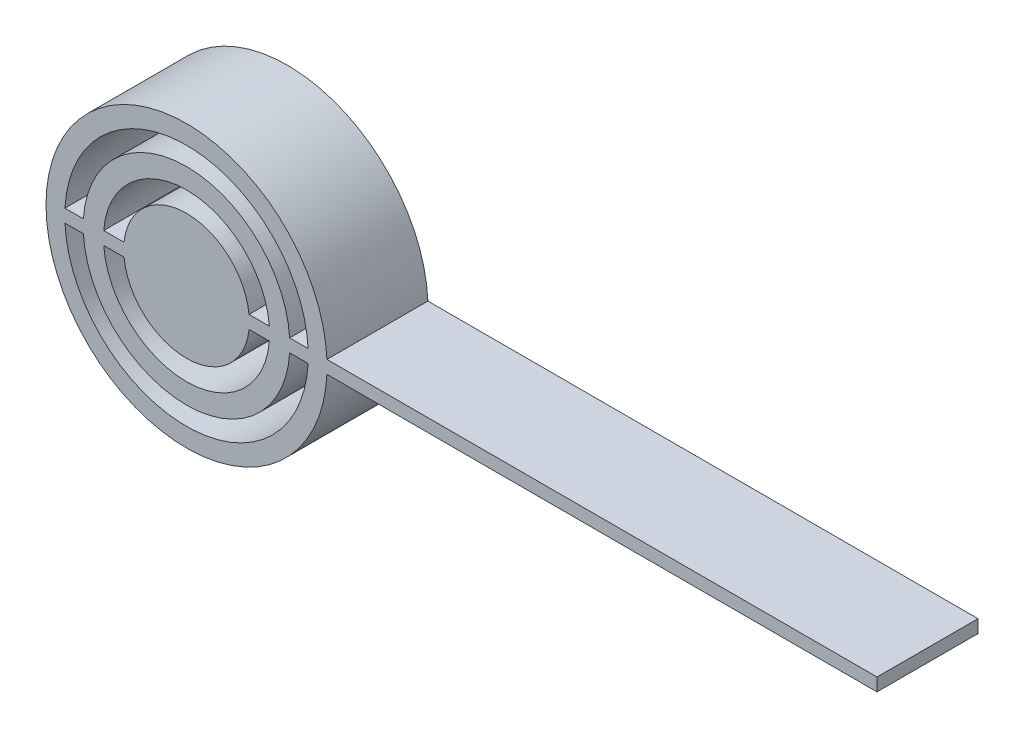
ISO-10303-21;
HEADER;
FILE_DESCRIPTION(('STEP AP214'),'2;1');
FILE_NAME('part.step','',(''),(''),'','','');
FILE_SCHEMA(('AUTOMOTIVE_DESIGN { 1 0 10303 214 1 1 1 1 }'));
ENDSEC;
DATA;
#1=APPLICATION_CONTEXT('core data for automotive mechanical design processes');
#2=APPLICATION_PROTOCOL_DEFINITION('international standard','automotive_design',2000,#1);
#3=PRODUCT_CONTEXT('',#1,'mechanical');
#4=PRODUCT('Part','Part','',(#3));
#5=PRODUCT_RELATED_PRODUCT_CATEGORY('part','',(#4));
#6=PRODUCT_DEFINITION_FORMATION('','',#4);
#7=PRODUCT_DEFINITION_CONTEXT('part definition',#1,'design');
#8=PRODUCT_DEFINITION('design','',#6,#7);
#9=PRODUCT_DEFINITION_SHAPE('','',#8);
#10=(LENGTH_UNIT() NAMED_UNIT(*) SI_UNIT(.MILLI.,.METRE.));
#11=(NAMED_UNIT(*) PLANE_ANGLE_UNIT() SI_UNIT($,.RADIAN.));
#12=(NAMED_UNIT(*) SI_UNIT($,.STERADIAN.) SOLID_ANGLE_UNIT());
#13=UNCERTAINTY_MEASURE_WITH_UNIT(LENGTH_MEASURE(1.E-05),#10,'distance_accuracy_value','');
#14=(GEOMETRIC_REPRESENTATION_CONTEXT(3) GLOBAL_UNCERTAINTY_ASSIGNED_CONTEXT((#13)) GLOBAL_UNIT_ASSIGNED_CONTEXT((#10,
#11,#12)) REPRESENTATION_CONTEXT('',''));
#15=CARTESIAN_POINT('',(0.,0.,0.));
#16=DIRECTION('',(0.,0.,1.));
#17=DIRECTION('',(1.,0.,0.));
#18=AXIS2_PLACEMENT_3D('',#15,#16,#17);
#19=CARTESIAN_POINT('',(0.,-2.55990989081378,40.));
#20=DIRECTION('',(0.,1.,0.));
#21=DIRECTION('',(0.,0.,1.));
#22=AXIS2_PLACEMENT_3D('',#19,#20,#21);
#23=PLANE('',#22);
#24=DIRECTION('',(1.,0.,0.));
#25=VECTOR('',#24,1.);
#26=CARTESIAN_POINT('',(0.,-2.55990989081378,0.));
#27=LINE('',#26,#25);
#28=CARTESIAN_POINT('',(-32.7995918708949,-2.55990989081378,0.));
#29=VERTEX_POINT('',#28);
#30=CARTESIAN_POINT('',(-24.7589770160316,-2.55990989081378,0.));
#31=VERTEX_POINT('',#30);
#32=EDGE_CURVE('E283',#29,#31,#27,.T.);
#33=ORIENTED_EDGE('',*,*,#32,.T.);
#34=DIRECTION('',(0.,0.,-1.));
#35=VECTOR('',#34,1.);
#36=CARTESIAN_POINT('',(-24.7589770160316,-2.55990989081378,40.));
#37=LINE('',#36,#35);
#38=CARTESIAN_POINT('',(-24.7589770160316,-2.55990989081378,40.));
#39=VERTEX_POINT('',#38);
#40=EDGE_CURVE('E11',#39,#31,#37,.T.);
#41=ORIENTED_EDGE('',*,*,#40,.F.);
#42=DIRECTION('',(1.,0.,0.));
#43=VECTOR('',#42,1.);
#44=CARTESIAN_POINT('',(0.,-2.55990989081378,40.));
#45=LINE('',#44,#43);
#46=CARTESIAN_POINT('',(-32.7995918708949,-2.55990989081378,40.));
#47=VERTEX_POINT('',#46);
#48=EDGE_CURVE('E199',#47,#39,#45,.T.);
#49=ORIENTED_EDGE('',*,*,#48,.F.);
#50=DIRECTION('',(0.,0.,-1.));
#51=VECTOR('',#50,1.);
#52=CARTESIAN_POINT('',(-32.7995918708949,-2.55990989081378,40.));
#53=LINE('',#52,#51);
#54=EDGE_CURVE('E67',#47,#29,#53,.T.);
#55=ORIENTED_EDGE('',*,*,#54,.T.);
#56=EDGE_LOOP('',(#33,#41,#49,#55));
#57=FACE_BOUND('',#56,.T.);
#58=ADVANCED_FACE('F47',(#57),#23,.F.);
#59=CARTESIAN_POINT('',(0.,0.,40.));
#60=DIRECTION('',(0.,0.,-1.));
#61=DIRECTION('',(-1.,0.,0.));
#62=AXIS2_PLACEMENT_3D('',#59,#60,#61);
#63=CYLINDRICAL_SURFACE('',#62,24.8909638529621);
#64=CARTESIAN_POINT('',(0.,0.,0.));
#65=DIRECTION('',(0.,0.,1.));
#66=DIRECTION('',(1.,0.,0.));
#67=AXIS2_PLACEMENT_3D('',#64,#65,#66);
#68=CIRCLE('',#67,24.8909638529621);
#69=CARTESIAN_POINT('',(24.7589770160316,-2.55990989081378,0.));
#70=VERTEX_POINT('',#69);
#71=EDGE_CURVE('E206',#31,#70,#68,.T.);
#72=ORIENTED_EDGE('',*,*,#71,.T.);
#73=DIRECTION('',(0.,0.,-1.));
#74=VECTOR('',#73,1.);
#75=CARTESIAN_POINT('',(24.7589770160316,-2.55990989081378,40.));
#76=LINE('',#75,#74);
#77=CARTESIAN_POINT('',(24.7589770160316,-2.55990989081378,40.));
#78=VERTEX_POINT('',#77);
#79=EDGE_CURVE('E58',#78,#70,#76,.T.);
#80=ORIENTED_EDGE('',*,*,#79,.F.);
#81=CARTESIAN_POINT('',(0.,0.,40.));
#82=DIRECTION('',(0.,0.,1.));
#83=DIRECTION('',(1.,0.,0.));
#84=AXIS2_PLACEMENT_3D('',#81,#82,#83);
#85=CIRCLE('',#84,24.8909638529621);
#86=EDGE_CURVE('E193',#39,#78,#85,.T.);
#87=ORIENTED_EDGE('',*,*,#86,.F.);
#88=ORIENTED_EDGE('',*,*,#40,.T.);
#89=EDGE_LOOP('',(#72,#80,#87,#88));
#90=FACE_BOUND('',#89,.T.);
#91=ADVANCED_FACE('F205',(#90),#63,.T.);
#92=CARTESIAN_POINT('',(0.,-2.55990989081378,40.));
#93=DIRECTION('',(0.,1.,0.));
#94=DIRECTION('',(0.,0.,1.));
#95=AXIS2_PLACEMENT_3D('',#92,#93,#94);
#96=PLANE('',#95);
#97=DIRECTION('',(1.,0.,0.));
#98=VECTOR('',#97,1.);
#99=CARTESIAN_POINT('',(0.,-2.55990989081378,0.));
#100=LINE('',#99,#98);
#101=CARTESIAN_POINT('',(32.7995918708949,-2.55990989081378,0.));
#102=VERTEX_POINT('',#101);
#103=EDGE_CURVE('E288',#70,#102,#100,.T.);
#104=ORIENTED_EDGE('',*,*,#103,.T.);
#105=DIRECTION('',(0.,0.,-1.));
#106=VECTOR('',#105,1.);
#107=CARTESIAN_POINT('',(32.7995918708949,-2.55990989081378,40.));
#108=LINE('',#107,#106);
#109=CARTESIAN_POINT('',(32.7995918708949,-2.55990989081378,40.));
#110=VERTEX_POINT('',#109);
#111=EDGE_CURVE('E130',#110,#102,#108,.T.);
#112=ORIENTED_EDGE('',*,*,#111,.F.);
#113=DIRECTION('',(1.,0.,0.));
#114=VECTOR('',#113,1.);
#115=CARTESIAN_POINT('',(0.,-2.55990989081378,40.));
#116=LINE('',#115,#114);
#117=EDGE_CURVE('E198',#78,#110,#116,.T.);
#118=ORIENTED_EDGE('',*,*,#117,.F.);
#119=ORIENTED_EDGE('',*,*,#79,.T.);
#120=EDGE_LOOP('',(#104,#112,#118,#119));
#121=FACE_BOUND('',#120,.T.);
#122=ADVANCED_FACE('F211',(#121),#96,.F.);
#123=CARTESIAN_POINT('',(0.,2.55990989081378,40.));
#124=DIRECTION('',(0.,1.,0.));
#125=DIRECTION('',(0.,0.,1.));
#126=AXIS2_PLACEMENT_3D('',#123,#124,#125);
#127=PLANE('',#126);
#128=DIRECTION('',(1.,0.,0.));
#129=VECTOR('',#128,1.);
#130=CARTESIAN_POINT('',(0.,2.55990989081378,0.));
#131=LINE('',#130,#129);
#132=CARTESIAN_POINT('',(40.8455882829981,2.55990989081378,0.));
#133=VERTEX_POINT('',#132);
#134=CARTESIAN_POINT('',(48.1587150737325,2.55990989081378,0.));
#135=VERTEX_POINT('',#134);
#136=EDGE_CURVE('E267',#133,#135,#131,.T.);
#137=ORIENTED_EDGE('',*,*,#136,.F.);
#138=DIRECTION('',(0.,0.,-1.));
#139=VECTOR('',#138,1.);
#140=CARTESIAN_POINT('',(40.8455882829981,2.55990989081378,40.));
#141=LINE('',#140,#139);
#142=CARTESIAN_POINT('',(40.8455882829981,2.55990989081378,40.));
#143=VERTEX_POINT('',#142);
#144=EDGE_CURVE('E298',#143,#133,#141,.T.);
#145=ORIENTED_EDGE('',*,*,#144,.F.);
#146=DIRECTION('',(1.,0.,0.));
#147=VECTOR('',#146,1.);
#148=CARTESIAN_POINT('',(0.,2.55990989081378,40.));
#149=LINE('',#148,#147);
#150=CARTESIAN_POINT('',(48.1587150737325,2.55990989081378,40.));
#151=VERTEX_POINT('',#150);
#152=EDGE_CURVE('E404',#143,#151,#149,.T.);
#153=ORIENTED_EDGE('',*,*,#152,.T.);
#154=DIRECTION('',(0.,0.,-1.));
#155=VECTOR('',#154,1.);
#156=CARTESIAN_POINT('',(48.1587150737325,2.55990989081378,40.));
#157=LINE('',#156,#155);
#158=EDGE_CURVE('E301',#151,#135,#157,.T.);
#159=ORIENTED_EDGE('',*,*,#158,.T.);
#160=EDGE_LOOP('',(#137,#145,#153,#159));
#161=FACE_BOUND('',#160,.T.);
#162=ADVANCED_FACE('F436',(#161),#127,.T.);
#163=CARTESIAN_POINT('',(0.,0.,40.));
#164=DIRECTION('',(0.,0.,-1.));
#165=DIRECTION('',(-1.,0.,0.));
#166=AXIS2_PLACEMENT_3D('',#163,#164,#165);
#167=CYLINDRICAL_SURFACE('',#166,40.9257281038869);
#168=CARTESIAN_POINT('',(0.,0.,0.));
#169=DIRECTION('',(0.,0.,1.));
#170=DIRECTION('',(1.,0.,0.));
#171=AXIS2_PLACEMENT_3D('',#168,#169,#170);
#172=CIRCLE('',#171,40.9257281038869);
#173=CARTESIAN_POINT('',(-40.8455882829981,2.55990989081378,0.));
#174=VERTEX_POINT('',#173);
#175=EDGE_CURVE('E271',#133,#174,#172,.T.);
#176=ORIENTED_EDGE('',*,*,#175,.T.);
#177=DIRECTION('',(0.,0.,-1.));
#178=VECTOR('',#177,1.);
#179=CARTESIAN_POINT('',(-40.8455882829981,2.55990989081378,40.));
#180=LINE('',#179,#178);
#181=CARTESIAN_POINT('',(-40.8455882829981,2.55990989081378,40.));
#182=VERTEX_POINT('',#181);
#183=EDGE_CURVE('E308',#182,#174,#180,.T.);
#184=ORIENTED_EDGE('',*,*,#183,.F.);
#185=CARTESIAN_POINT('',(0.,0.,40.));
#186=DIRECTION('',(0.,0.,1.));
#187=DIRECTION('',(1.,0.,0.));
#188=AXIS2_PLACEMENT_3D('',#185,#186,#187);
#189=CIRCLE('',#188,40.9257281038869);
#190=EDGE_CURVE('E408',#143,#182,#189,.T.);
#191=ORIENTED_EDGE('',*,*,#190,.F.);
#192=ORIENTED_EDGE('',*,*,#144,.T.);
#193=EDGE_LOOP('',(#176,#184,#191,#192));
#194=FACE_BOUND('',#193,.T.);
#195=ADVANCED_FACE('F438',(#194),#167,.T.);
#196=CARTESIAN_POINT('',(0.,2.55990989081378,40.));
#197=DIRECTION('',(0.,1.,0.));
#198=DIRECTION('',(0.,0.,1.));
#199=AXIS2_PLACEMENT_3D('',#196,#197,#198);
#200=PLANE('',#199);
#201=DIRECTION('',(1.,0.,0.));
#202=VECTOR('',#201,1.);
#203=CARTESIAN_POINT('',(0.,2.55990989081378,0.));
#204=LINE('',#203,#202);
#205=CARTESIAN_POINT('',(-48.1587150737325,2.55990989081378,0.));
#206=VERTEX_POINT('',#205);
#207=EDGE_CURVE('E275',#206,#174,#204,.T.);
#208=ORIENTED_EDGE('',*,*,#207,.F.);
#209=DIRECTION('',(0.,0.,-1.));
#210=VECTOR('',#209,1.);
#211=CARTESIAN_POINT('',(-48.1587150737325,2.55990989081378,40.));
#212=LINE('',#211,#210);
#213=CARTESIAN_POINT('',(-48.1587150737325,2.55990989081378,40.));
#214=VERTEX_POINT('',#213);
#215=EDGE_CURVE('E304',#214,#206,#212,.T.);
#216=ORIENTED_EDGE('',*,*,#215,.F.);
#217=DIRECTION('',(1.,0.,0.));
#218=VECTOR('',#217,1.);
#219=CARTESIAN_POINT('',(0.,2.55990989081378,40.));
#220=LINE('',#219,#218);
#221=EDGE_CURVE('E411',#214,#182,#220,.T.);
#222=ORIENTED_EDGE('',*,*,#221,.T.);
#223=ORIENTED_EDGE('',*,*,#183,.T.);
#224=EDGE_LOOP('',(#208,#216,#222,#223));
#225=FACE_BOUND('',#224,.T.);
#226=ADVANCED_FACE('F430',(#225),#200,.T.);
#227=CARTESIAN_POINT('',(0.,-2.55990989081378,40.));
#228=DIRECTION('',(0.,1.,0.));
#229=DIRECTION('',(0.,0.,1.));
#230=AXIS2_PLACEMENT_3D('',#227,#228,#229);
#231=PLANE('',#230);
#232=DIRECTION('',(1.,0.,0.));
#233=VECTOR('',#232,1.);
#234=CARTESIAN_POINT('',(0.,-2.55990989081378,0.));
#235=LINE('',#234,#233);
#236=CARTESIAN_POINT('',(-48.1587150737325,-2.55990989081378,0.));
#237=VERTEX_POINT('',#236);
#238=CARTESIAN_POINT('',(-40.8455882829981,-2.55990989081378,0.));
#239=VERTEX_POINT('',#238);
#240=EDGE_CURVE('E252',#237,#239,#235,.T.);
#241=ORIENTED_EDGE('',*,*,#240,.T.);
#242=DIRECTION('',(0.,0.,-1.));
#243=VECTOR('',#242,1.);
#244=CARTESIAN_POINT('',(-40.8455882829981,-2.55990989081378,40.));
#245=LINE('',#244,#243);
#246=CARTESIAN_POINT('',(-40.8455882829981,-2.55990989081378,40.));
#247=VERTEX_POINT('',#246);
#248=EDGE_CURVE('E305',#247,#239,#245,.T.);
#249=ORIENTED_EDGE('',*,*,#248,.F.);
#250=DIRECTION('',(1.,0.,0.));
#251=VECTOR('',#250,1.);
#252=CARTESIAN_POINT('',(0.,-2.55990989081378,40.));
#253=LINE('',#252,#251);
#254=CARTESIAN_POINT('',(-48.1587150737325,-2.55990989081378,40.));
#255=VERTEX_POINT('',#254);
#256=EDGE_CURVE('E390',#255,#247,#253,.T.);
#257=ORIENTED_EDGE('',*,*,#256,.F.);
#258=DIRECTION('',(0.,0.,-1.));
#259=VECTOR('',#258,1.);
#260=CARTESIAN_POINT('',(-48.1587150737325,-2.55990989081378,40.));
#261=LINE('',#260,#259);
#262=EDGE_CURVE('E313',#255,#237,#261,.T.);
#263=ORIENTED_EDGE('',*,*,#262,.T.);
#264=EDGE_LOOP('',(#241,#249,#257,#263));
#265=FACE_BOUND('',#264,.T.);
#266=ADVANCED_FACE('F445',(#265),#231,.F.);
#267=CARTESIAN_POINT('',(0.,0.,40.));
#268=DIRECTION('',(0.,0.,-1.));
#269=DIRECTION('',(-1.,0.,0.));
#270=AXIS2_PLACEMENT_3D('',#267,#268,#269);
#271=CYLINDRICAL_SURFACE('',#270,40.9257281038869);
#272=CARTESIAN_POINT('',(0.,0.,0.));
#273=DIRECTION('',(0.,0.,1.));
#274=DIRECTION('',(1.,0.,0.));
#275=AXIS2_PLACEMENT_3D('',#272,#273,#274);
#276=CIRCLE('',#275,40.9257281038869);
#277=CARTESIAN_POINT('',(40.8455882829981,-2.55990989081378,0.));
#278=VERTEX_POINT('',#277);
#279=EDGE_CURVE('E256',#239,#278,#276,.T.);
#280=ORIENTED_EDGE('',*,*,#279,.T.);
#281=DIRECTION('',(0.,0.,-1.));
#282=VECTOR('',#281,1.);
#283=CARTESIAN_POINT('',(40.8455882829981,-2.55990989081378,40.));
#284=LINE('',#283,#282);
#285=CARTESIAN_POINT('',(40.8455882829981,-2.55990989081378,40.));
#286=VERTEX_POINT('',#285);
#287=EDGE_CURVE('E320',#286,#278,#284,.T.);
#288=ORIENTED_EDGE('',*,*,#287,.F.);
#289=CARTESIAN_POINT('',(0.,0.,40.));
#290=DIRECTION('',(0.,0.,1.));
#291=DIRECTION('',(1.,0.,0.));
#292=AXIS2_PLACEMENT_3D('',#289,#290,#291);
#293=CIRCLE('',#292,40.9257281038869);
#294=EDGE_CURVE('E394',#247,#286,#293,.T.);
#295=ORIENTED_EDGE('',*,*,#294,.F.);
#296=ORIENTED_EDGE('',*,*,#248,.T.);
#297=EDGE_LOOP('',(#280,#288,#295,#296));
#298=FACE_BOUND('',#297,.T.);
#299=ADVANCED_FACE('F491',(#298),#271,.T.);
#300=CARTESIAN_POINT('',(0.,-2.55990989081378,40.));
#301=DIRECTION('',(0.,1.,0.));
#302=DIRECTION('',(0.,0.,1.));
#303=AXIS2_PLACEMENT_3D('',#300,#301,#302);
#304=PLANE('',#303);
#305=DIRECTION('',(1.,0.,0.));
#306=VECTOR('',#305,1.);
#307=CARTESIAN_POINT('',(0.,-2.55990989081378,0.));
#308=LINE('',#307,#306);
#309=CARTESIAN_POINT('',(48.1587150737325,-2.55990989081378,0.));
#310=VERTEX_POINT('',#309);
#311=EDGE_CURVE('E259',#278,#310,#308,.T.);
#312=ORIENTED_EDGE('',*,*,#311,.T.);
#313=DIRECTION('',(0.,0.,-1.));
#314=VECTOR('',#313,1.);
#315=CARTESIAN_POINT('',(48.1587150737325,-2.55990989081378,40.));
#316=LINE('',#315,#314);
#317=CARTESIAN_POINT('',(48.1587150737325,-2.55990989081378,40.));
#318=VERTEX_POINT('',#317);
#319=EDGE_CURVE('E316',#318,#310,#316,.T.);
#320=ORIENTED_EDGE('',*,*,#319,.F.);
#321=DIRECTION('',(1.,0.,0.));
#322=VECTOR('',#321,1.);
#323=CARTESIAN_POINT('',(0.,-2.55990989081378,40.));
#324=LINE('',#323,#322);
#325=EDGE_CURVE('E397',#286,#318,#324,.T.);
#326=ORIENTED_EDGE('',*,*,#325,.F.);
#327=ORIENTED_EDGE('',*,*,#287,.T.);
#328=EDGE_LOOP('',(#312,#320,#326,#327));
#329=FACE_BOUND('',#328,.T.);
#330=ADVANCED_FACE('F477',(#329),#304,.F.);
#331=CARTESIAN_POINT('',(0.,2.55990989081378,40.));
#332=DIRECTION('',(0.,1.,0.));
#333=DIRECTION('',(-1.,0.,0.));
#334=AXIS2_PLACEMENT_3D('',#331,#332,#333);
#335=PLANE('',#334);
#336=DIRECTION('',(1.,0.,0.));
#337=VECTOR('',#336,1.);
#338=CARTESIAN_POINT('',(0.,2.55990989081378,0.));
#339=LINE('',#338,#337);
#340=CARTESIAN_POINT('',(55.6012303878442,2.55990989081378,0.));
#341=VERTEX_POINT('',#340);
#342=CARTESIAN_POINT('',(273.486476263775,2.55990989081378,0.));
#343=VERTEX_POINT('',#342);
#344=EDGE_CURVE('E236',#341,#343,#339,.T.);
#345=ORIENTED_EDGE('',*,*,#344,.F.);
#346=DIRECTION('',(0.,0.,-1.));
#347=VECTOR('',#346,1.);
#348=CARTESIAN_POINT('',(55.6012303878442,2.55990989081378,40.));
#349=LINE('',#348,#347);
#350=CARTESIAN_POINT('',(55.6012303878442,2.55990989081378,40.));
#351=VERTEX_POINT('',#350);
#352=EDGE_CURVE('E317',#351,#341,#349,.T.);
#353=ORIENTED_EDGE('',*,*,#352,.F.);
#354=DIRECTION('',(1.,0.,0.));
#355=VECTOR('',#354,1.);
#356=CARTESIAN_POINT('',(0.,2.55990989081378,40.));
#357=LINE('',#356,#355);
#358=CARTESIAN_POINT('',(273.486476263775,2.55990989081378,40.));
#359=VERTEX_POINT('',#358);
#360=EDGE_CURVE('E370',#351,#359,#357,.T.);
#361=ORIENTED_EDGE('',*,*,#360,.T.);
#362=DIRECTION('',(0.,0.,-1.));
#363=VECTOR('',#362,1.);
#364=CARTESIAN_POINT('',(273.486476263775,2.55990989081378,40.));
#365=LINE('',#364,#363);
#366=EDGE_CURVE('E327',#359,#343,#365,.T.);
#367=ORIENTED_EDGE('',*,*,#366,.T.);
#368=EDGE_LOOP('',(#345,#353,#361,#367));
#369=FACE_BOUND('',#368,.T.);
#370=ADVANCED_FACE('F473',(#369),#335,.T.);
#371=CARTESIAN_POINT('',(0.,0.,40.));
#372=DIRECTION('',(0.,0.,-1.));
#373=DIRECTION('',(-1.,0.,0.));
#374=AXIS2_PLACEMENT_3D('',#371,#372,#373);
#375=CYLINDRICAL_SURFACE('',#374,55.6601289909682);
#376=CARTESIAN_POINT('',(0.,0.,0.));
#377=DIRECTION('',(0.,0.,1.));
#378=DIRECTION('',(1.,0.,0.));
#379=AXIS2_PLACEMENT_3D('',#376,#377,#378);
#380=CIRCLE('',#379,55.6601289909682);
#381=CARTESIAN_POINT('',(55.6012303878442,-2.55990989081378,0.));
#382=VERTEX_POINT('',#381);
#383=EDGE_CURVE('E240',#341,#382,#380,.T.);
#384=ORIENTED_EDGE('',*,*,#383,.T.);
#385=DIRECTION('',(0.,0.,-1.));
#386=VECTOR('',#385,1.);
#387=CARTESIAN_POINT('',(55.6012303878442,-2.55990989081378,40.));
#388=LINE('',#387,#386);
#389=CARTESIAN_POINT('',(55.6012303878442,-2.55990989081378,40.));
#390=VERTEX_POINT('',#389);
#391=EDGE_CURVE('E334',#390,#382,#388,.T.);
#392=ORIENTED_EDGE('',*,*,#391,.F.);
#393=CARTESIAN_POINT('',(0.,0.,40.));
#394=DIRECTION('',(0.,0.,1.));
#395=DIRECTION('',(1.,0.,0.));
#396=AXIS2_PLACEMENT_3D('',#393,#394,#395);
#397=CIRCLE('',#396,55.6601289909682);
#398=EDGE_CURVE('E375',#351,#390,#397,.T.);
#399=ORIENTED_EDGE('',*,*,#398,.F.);
#400=ORIENTED_EDGE('',*,*,#352,.T.);
#401=EDGE_LOOP('',(#384,#392,#399,#400));
#402=FACE_BOUND('',#401,.T.);
#403=ADVANCED_FACE('F476',(#402),#375,.T.);
#404=CARTESIAN_POINT('',(0.,-2.55990989081378,40.));
#405=DIRECTION('',(0.,1.,0.));
#406=DIRECTION('',(-1.,0.,0.));
#407=AXIS2_PLACEMENT_3D('',#404,#405,#406);
#408=PLANE('',#407);
#409=DIRECTION('',(1.,0.,0.));
#410=VECTOR('',#409,1.);
#411=CARTESIAN_POINT('',(0.,-2.55990989081378,0.));
#412=LINE('',#411,#410);
#413=CARTESIAN_POINT('',(273.486476263775,-2.55990989081378,0.));
#414=VERTEX_POINT('',#413);
#415=EDGE_CURVE('E244',#382,#414,#412,.T.);
#416=ORIENTED_EDGE('',*,*,#415,.T.);
#417=DIRECTION('',(0.,0.,-1.));
#418=VECTOR('',#417,1.);
#419=CARTESIAN_POINT('',(273.486476263775,-2.55990989081378,40.));
#420=LINE('',#419,#418);
#421=CARTESIAN_POINT('',(273.486476263775,-2.55990989081378,40.));
#422=VERTEX_POINT('',#421);
#423=EDGE_CURVE('E330',#422,#414,#420,.T.);
#424=ORIENTED_EDGE('',*,*,#423,.F.);
#425=DIRECTION('',(1.,0.,0.));
#426=VECTOR('',#425,1.);
#427=CARTESIAN_POINT('',(0.,-2.55990989081378,40.));
#428=LINE('',#427,#426);
#429=EDGE_CURVE('E383',#390,#422,#428,.T.);
#430=ORIENTED_EDGE('',*,*,#429,.F.);
#431=ORIENTED_EDGE('',*,*,#391,.T.);
#432=EDGE_LOOP('',(#416,#424,#430,#431));
#433=FACE_BOUND('',#432,.T.);
#434=ADVANCED_FACE('F481',(#433),#408,.F.);
#435=CARTESIAN_POINT('',(0.,0.,40.));
#436=DIRECTION('',(0.,0.,-1.));
#437=DIRECTION('',(-1.,0.,0.));
#438=AXIS2_PLACEMENT_3D('',#435,#436,#437);
#439=CYLINDRICAL_SURFACE('',#438,32.8993368557234);
#440=CARTESIAN_POINT('',(0.,0.,0.));
#441=DIRECTION('',(0.,0.,1.));
#442=DIRECTION('',(1.,0.,0.));
#443=AXIS2_PLACEMENT_3D('',#440,#441,#442);
#444=CIRCLE('',#443,32.8993368557234);
#445=CARTESIAN_POINT('',(32.7995918708949,2.55990989081378,0.));
#446=VERTEX_POINT('',#445);
#447=CARTESIAN_POINT('',(-32.7995918708949,2.55990989081378,0.));
#448=VERTEX_POINT('',#447);
#449=EDGE_CURVE('E220',#446,#448,#444,.T.);
#450=ORIENTED_EDGE('',*,*,#449,.F.);
#451=DIRECTION('',(0.,0.,-1.));
#452=VECTOR('',#451,1.);
#453=CARTESIAN_POINT('',(32.7995918708949,2.55990989081378,40.));
#454=LINE('',#453,#452);
#455=CARTESIAN_POINT('',(32.7995918708949,2.55990989081378,40.));
#456=VERTEX_POINT('',#455);
#457=EDGE_CURVE('E51',#456,#446,#454,.T.);
#458=ORIENTED_EDGE('',*,*,#457,.F.);
#459=CARTESIAN_POINT('',(0.,0.,40.));
#460=DIRECTION('',(0.,0.,1.));
#461=DIRECTION('',(1.,0.,0.));
#462=AXIS2_PLACEMENT_3D('',#459,#460,#461);
#463=CIRCLE('',#462,32.8993368557234);
#464=CARTESIAN_POINT('',(-32.7995918708949,2.55990989081378,40.));
#465=VERTEX_POINT('',#464);
#466=EDGE_CURVE('E295',#456,#465,#463,.T.);
#467=ORIENTED_EDGE('',*,*,#466,.T.);
#468=DIRECTION('',(0.,0.,-1.));
#469=VECTOR('',#468,1.);
#470=CARTESIAN_POINT('',(-32.7995918708949,2.55990989081378,40.));
#471=LINE('',#470,#469);
#472=EDGE_CURVE('E216',#465,#448,#471,.T.);
#473=ORIENTED_EDGE('',*,*,#472,.T.);
#474=EDGE_LOOP('',(#450,#458,#467,#473));
#475=FACE_BOUND('',#474,.T.);
#476=ADVANCED_FACE('F49',(#475),#439,.F.);
#477=CARTESIAN_POINT('',(0.,2.55990989081378,40.));
#478=DIRECTION('',(0.,1.,0.));
#479=DIRECTION('',(0.,0.,1.));
#480=AXIS2_PLACEMENT_3D('',#477,#478,#479);
#481=PLANE('',#480);
#482=DIRECTION('',(1.,0.,0.));
#483=VECTOR('',#482,1.);
#484=CARTESIAN_POINT('',(0.,2.55990989081378,0.));
#485=LINE('',#484,#483);
#486=CARTESIAN_POINT('',(24.7589770160316,2.55990989081378,0.));
#487=VERTEX_POINT('',#486);
#488=EDGE_CURVE('E224',#487,#446,#485,.T.);
#489=ORIENTED_EDGE('',*,*,#488,.F.);
#490=DIRECTION('',(0.,0.,-1.));
#491=VECTOR('',#490,1.);
#492=CARTESIAN_POINT('',(24.7589770160316,2.55990989081378,40.));
#493=LINE('',#492,#491);
#494=CARTESIAN_POINT('',(24.7589770160316,2.55990989081378,40.));
#495=VERTEX_POINT('',#494);
#496=EDGE_CURVE('E344',#495,#487,#493,.T.);
#497=ORIENTED_EDGE('',*,*,#496,.F.);
#498=DIRECTION('',(1.,0.,0.));
#499=VECTOR('',#498,1.);
#500=CARTESIAN_POINT('',(0.,2.55990989081378,40.));
#501=LINE('',#500,#499);
#502=EDGE_CURVE('E355',#495,#456,#501,.T.);
#503=ORIENTED_EDGE('',*,*,#502,.T.);
#504=ORIENTED_EDGE('',*,*,#457,.T.);
#505=EDGE_LOOP('',(#489,#497,#503,#504));
#506=FACE_BOUND('',#505,.T.);
#507=ADVANCED_FACE('F353',(#506),#481,.T.);
#508=CARTESIAN_POINT('',(0.,0.,40.));
#509=DIRECTION('',(0.,0.,-1.));
#510=DIRECTION('',(-1.,0.,0.));
#511=AXIS2_PLACEMENT_3D('',#508,#509,#510);
#512=CYLINDRICAL_SURFACE('',#511,24.8909638529621);
#513=CARTESIAN_POINT('',(0.,0.,0.));
#514=DIRECTION('',(0.,0.,1.));
#515=DIRECTION('',(1.,0.,0.));
#516=AXIS2_PLACEMENT_3D('',#513,#514,#515);
#517=CIRCLE('',#516,24.8909638529621);
#518=CARTESIAN_POINT('',(-24.7589770160316,2.55990989081378,0.));
#519=VERTEX_POINT('',#518);
#520=EDGE_CURVE('E228',#487,#519,#517,.T.);
#521=ORIENTED_EDGE('',*,*,#520,.T.);
#522=DIRECTION('',(0.,0.,-1.));
#523=VECTOR('',#522,1.);
#524=CARTESIAN_POINT('',(-24.7589770160316,2.55990989081378,40.));
#525=LINE('',#524,#523);
#526=CARTESIAN_POINT('',(-24.7589770160316,2.55990989081378,40.));
#527=VERTEX_POINT('',#526);
#528=EDGE_CURVE('E342',#527,#519,#525,.T.);
#529=ORIENTED_EDGE('',*,*,#528,.F.);
#530=CARTESIAN_POINT('',(0.,0.,40.));
#531=DIRECTION('',(0.,0.,1.));
#532=DIRECTION('',(1.,0.,0.));
#533=AXIS2_PLACEMENT_3D('',#530,#531,#532);
#534=CIRCLE('',#533,24.8909638529621);
#535=EDGE_CURVE('E363',#495,#527,#534,.T.);
#536=ORIENTED_EDGE('',*,*,#535,.F.);
#537=ORIENTED_EDGE('',*,*,#496,.T.);
#538=EDGE_LOOP('',(#521,#529,#536,#537));
#539=FACE_BOUND('',#538,.T.);
#540=ADVANCED_FACE('F361',(#539),#512,.T.);
#541=CARTESIAN_POINT('',(0.,0.,40.));
#542=DIRECTION('',(0.,0.,-1.));
#543=DIRECTION('',(-1.,0.,0.));
#544=AXIS2_PLACEMENT_3D('',#541,#542,#543);
#545=CYLINDRICAL_SURFACE('',#544,48.2267039740643);
#546=CARTESIAN_POINT('',(0.,0.,0.));
#547=DIRECTION('',(0.,0.,1.));
#548=DIRECTION('',(1.,0.,0.));
#549=AXIS2_PLACEMENT_3D('',#546,#547,#548);
#550=CIRCLE('',#549,48.2267039740643);
#551=EDGE_CURVE('E279',#135,#206,#550,.T.);
#552=ORIENTED_EDGE('',*,*,#551,.F.);
#553=ORIENTED_EDGE('',*,*,#158,.F.);
#554=CARTESIAN_POINT('',(0.,0.,40.));
#555=DIRECTION('',(0.,0.,1.));
#556=DIRECTION('',(1.,0.,0.));
#557=AXIS2_PLACEMENT_3D('',#554,#555,#556);
#558=CIRCLE('',#557,48.2267039740643);
#559=EDGE_CURVE('E415',#151,#214,#558,.T.);
#560=ORIENTED_EDGE('',*,*,#559,.T.);
#561=ORIENTED_EDGE('',*,*,#215,.T.);
#562=EDGE_LOOP('',(#552,#553,#560,#561));
#563=FACE_BOUND('',#562,.T.);
#564=ADVANCED_FACE('F422',(#563),#545,.F.);
#565=CARTESIAN_POINT('',(0.,0.,40.));
#566=DIRECTION('',(0.,0.,-1.));
#567=DIRECTION('',(-1.,0.,0.));
#568=AXIS2_PLACEMENT_3D('',#565,#566,#567);
#569=CYLINDRICAL_SURFACE('',#568,48.2267039740643);
#570=CARTESIAN_POINT('',(0.,0.,0.));
#571=DIRECTION('',(0.,0.,1.));
#572=DIRECTION('',(1.,0.,0.));
#573=AXIS2_PLACEMENT_3D('',#570,#571,#572);
#574=CIRCLE('',#573,48.2267039740643);
#575=EDGE_CURVE('E263',#237,#310,#574,.T.);
#576=ORIENTED_EDGE('',*,*,#575,.F.);
#577=ORIENTED_EDGE('',*,*,#262,.F.);
#578=CARTESIAN_POINT('',(0.,0.,40.));
#579=DIRECTION('',(0.,0.,1.));
#580=DIRECTION('',(1.,0.,0.));
#581=AXIS2_PLACEMENT_3D('',#578,#579,#580);
#582=CIRCLE('',#581,48.2267039740643);
#583=EDGE_CURVE('E400',#255,#318,#582,.T.);
#584=ORIENTED_EDGE('',*,*,#583,.T.);
#585=ORIENTED_EDGE('',*,*,#319,.T.);
#586=EDGE_LOOP('',(#576,#577,#584,#585));
#587=FACE_BOUND('',#586,.T.);
#588=ADVANCED_FACE('F457',(#587),#569,.F.);
#589=CARTESIAN_POINT('',(273.486476263775,0.,40.));
#590=DIRECTION('',(-1.,0.,0.));
#591=DIRECTION('',(0.,0.,1.));
#592=AXIS2_PLACEMENT_3D('',#589,#590,#591);
#593=PLANE('',#592);
#594=DIRECTION('',(0.,1.,0.));
#595=VECTOR('',#594,1.);
#596=CARTESIAN_POINT('',(273.486476263775,0.,0.));
#597=LINE('',#596,#595);
#598=EDGE_CURVE('E248',#414,#343,#597,.T.);
#599=ORIENTED_EDGE('',*,*,#598,.T.);
#600=ORIENTED_EDGE('',*,*,#366,.F.);
#601=DIRECTION('',(0.,1.,0.));
#602=VECTOR('',#601,1.);
#603=CARTESIAN_POINT('',(273.486476263775,0.,40.));
#604=LINE('',#603,#602);
#605=EDGE_CURVE('E387',#422,#359,#604,.T.);
#606=ORIENTED_EDGE('',*,*,#605,.F.);
#607=ORIENTED_EDGE('',*,*,#423,.T.);
#608=EDGE_LOOP('',(#599,#600,#606,#607));
#609=FACE_BOUND('',#608,.T.);
#610=ADVANCED_FACE('F462',(#609),#593,.F.);
#611=CARTESIAN_POINT('',(0.,2.55990989081378,40.));
#612=DIRECTION('',(0.,1.,0.));
#613=DIRECTION('',(0.,0.,1.));
#614=AXIS2_PLACEMENT_3D('',#611,#612,#613);
#615=PLANE('',#614);
#616=DIRECTION('',(1.,0.,0.));
#617=VECTOR('',#616,1.);
#618=CARTESIAN_POINT('',(0.,2.55990989081378,0.));
#619=LINE('',#618,#617);
#620=EDGE_CURVE('E232',#448,#519,#619,.T.);
#621=ORIENTED_EDGE('',*,*,#620,.F.);
#622=ORIENTED_EDGE('',*,*,#472,.F.);
#623=DIRECTION('',(1.,0.,0.));
#624=VECTOR('',#623,1.);
#625=CARTESIAN_POINT('',(0.,2.55990989081378,40.));
#626=LINE('',#625,#624);
#627=EDGE_CURVE('E366',#465,#527,#626,.T.);
#628=ORIENTED_EDGE('',*,*,#627,.T.);
#629=ORIENTED_EDGE('',*,*,#528,.T.);
#630=EDGE_LOOP('',(#621,#622,#628,#629));
#631=FACE_BOUND('',#630,.T.);
#632=ADVANCED_FACE('F367',(#631),#615,.T.);
#633=CARTESIAN_POINT('',(0.,0.,40.));
#634=DIRECTION('',(0.,0.,-1.));
#635=DIRECTION('',(-1.,0.,0.));
#636=AXIS2_PLACEMENT_3D('',#633,#634,#635);
#637=CYLINDRICAL_SURFACE('',#636,32.8993368557234);
#638=CARTESIAN_POINT('',(0.,0.,0.));
#639=DIRECTION('',(0.,0.,1.));
#640=DIRECTION('',(1.,0.,0.));
#641=AXIS2_PLACEMENT_3D('',#638,#639,#640);
#642=CIRCLE('',#641,32.8993368557234);
#643=EDGE_CURVE('E291',#29,#102,#642,.T.);
#644=ORIENTED_EDGE('',*,*,#643,.F.);
#645=ORIENTED_EDGE('',*,*,#54,.F.);
#646=CARTESIAN_POINT('',(0.,0.,40.));
#647=DIRECTION('',(0.,0.,1.));
#648=DIRECTION('',(1.,0.,0.));
#649=AXIS2_PLACEMENT_3D('',#646,#647,#648);
#650=CIRCLE('',#649,32.8993368557234);
#651=EDGE_CURVE('E213',#47,#110,#650,.T.);
#652=ORIENTED_EDGE('',*,*,#651,.T.);
#653=ORIENTED_EDGE('',*,*,#111,.T.);
#654=EDGE_LOOP('',(#644,#645,#652,#653));
#655=FACE_BOUND('',#654,.T.);
#656=ADVANCED_FACE('F472',(#655),#637,.F.);
#657=CARTESIAN_POINT('',(0.,0.,40.));
#658=DIRECTION('',(0.,0.,1.));
#659=DIRECTION('',(1.,0.,0.));
#660=AXIS2_PLACEMENT_3D('',#657,#658,#659);
#661=PLANE('',#660);
#662=ORIENTED_EDGE('',*,*,#466,.F.);
#663=ORIENTED_EDGE('',*,*,#502,.F.);
#664=ORIENTED_EDGE('',*,*,#535,.T.);
#665=ORIENTED_EDGE('',*,*,#627,.F.);
#666=EDGE_LOOP('',(#662,#663,#664,#665));
#667=FACE_BOUND('',#666,.T.);
#668=ORIENTED_EDGE('',*,*,#360,.F.);
#669=ORIENTED_EDGE('',*,*,#398,.T.);
#670=ORIENTED_EDGE('',*,*,#429,.T.);
#671=ORIENTED_EDGE('',*,*,#605,.T.);
#672=EDGE_LOOP('',(#668,#669,#670,#671));
#673=FACE_BOUND('',#672,.T.);
#674=ORIENTED_EDGE('',*,*,#256,.T.);
#675=ORIENTED_EDGE('',*,*,#294,.T.);
#676=ORIENTED_EDGE('',*,*,#325,.T.);
#677=ORIENTED_EDGE('',*,*,#583,.F.);
#678=EDGE_LOOP('',(#674,#675,#676,#677));
#679=FACE_BOUND('',#678,.T.);
#680=ORIENTED_EDGE('',*,*,#152,.F.);
#681=ORIENTED_EDGE('',*,*,#190,.T.);
#682=ORIENTED_EDGE('',*,*,#221,.F.);
#683=ORIENTED_EDGE('',*,*,#559,.F.);
#684=EDGE_LOOP('',(#680,#681,#682,#683));
#685=FACE_BOUND('',#684,.T.);
#686=ORIENTED_EDGE('',*,*,#48,.T.);
#687=ORIENTED_EDGE('',*,*,#86,.T.);
#688=ORIENTED_EDGE('',*,*,#117,.T.);
#689=ORIENTED_EDGE('',*,*,#651,.F.);
#690=EDGE_LOOP('',(#686,#687,#688,#689));
#691=FACE_BOUND('',#690,.T.);
#692=ADVANCED_FACE('F195',(#667,#673,#679,#685,#691),#661,.T.);
#693=CARTESIAN_POINT('',(0.,0.,0.));
#694=DIRECTION('',(0.,0.,1.));
#695=DIRECTION('',(1.,0.,0.));
#696=AXIS2_PLACEMENT_3D('',#693,#694,#695);
#697=PLANE('',#696);
#698=ORIENTED_EDGE('',*,*,#449,.T.);
#699=ORIENTED_EDGE('',*,*,#620,.T.);
#700=ORIENTED_EDGE('',*,*,#520,.F.);
#701=ORIENTED_EDGE('',*,*,#488,.T.);
#702=EDGE_LOOP('',(#698,#699,#700,#701));
#703=FACE_BOUND('',#702,.T.);
#704=ORIENTED_EDGE('',*,*,#344,.T.);
#705=ORIENTED_EDGE('',*,*,#598,.F.);
#706=ORIENTED_EDGE('',*,*,#415,.F.);
#707=ORIENTED_EDGE('',*,*,#383,.F.);
#708=EDGE_LOOP('',(#704,#705,#706,#707));
#709=FACE_BOUND('',#708,.T.);
#710=ORIENTED_EDGE('',*,*,#240,.F.);
#711=ORIENTED_EDGE('',*,*,#575,.T.);
#712=ORIENTED_EDGE('',*,*,#311,.F.);
#713=ORIENTED_EDGE('',*,*,#279,.F.);
#714=EDGE_LOOP('',(#710,#711,#712,#713));
#715=FACE_BOUND('',#714,.T.);
#716=ORIENTED_EDGE('',*,*,#136,.T.);
#717=ORIENTED_EDGE('',*,*,#551,.T.);
#718=ORIENTED_EDGE('',*,*,#207,.T.);
#719=ORIENTED_EDGE('',*,*,#175,.F.);
#720=EDGE_LOOP('',(#716,#717,#718,#719));
#721=FACE_BOUND('',#720,.T.);
#722=ORIENTED_EDGE('',*,*,#32,.F.);
#723=ORIENTED_EDGE('',*,*,#643,.T.);
#724=ORIENTED_EDGE('',*,*,#103,.F.);
#725=ORIENTED_EDGE('',*,*,#71,.F.);
#726=EDGE_LOOP('',(#722,#723,#724,#725));
#727=FACE_BOUND('',#726,.T.);
#728=ADVANCED_FACE('F358',(#703,#709,#715,#721,#727),#697,.F.);
#729=CLOSED_SHELL('',(#58,#91,#122,#162,#195,#226,#266,#299,#330,#370,#403,#434,#476,#507,#540,
#564,#588,#610,#632,#656,#692,#728));
#730=MANIFOLD_SOLID_BREP('B2',#729);
#731=ADVANCED_BREP_SHAPE_REPRESENTATION('',(#18,#730),#14);
#732=SHAPE_DEFINITION_REPRESENTATION(#9,#731);
ENDSEC;
END-ISO-10303-21;
